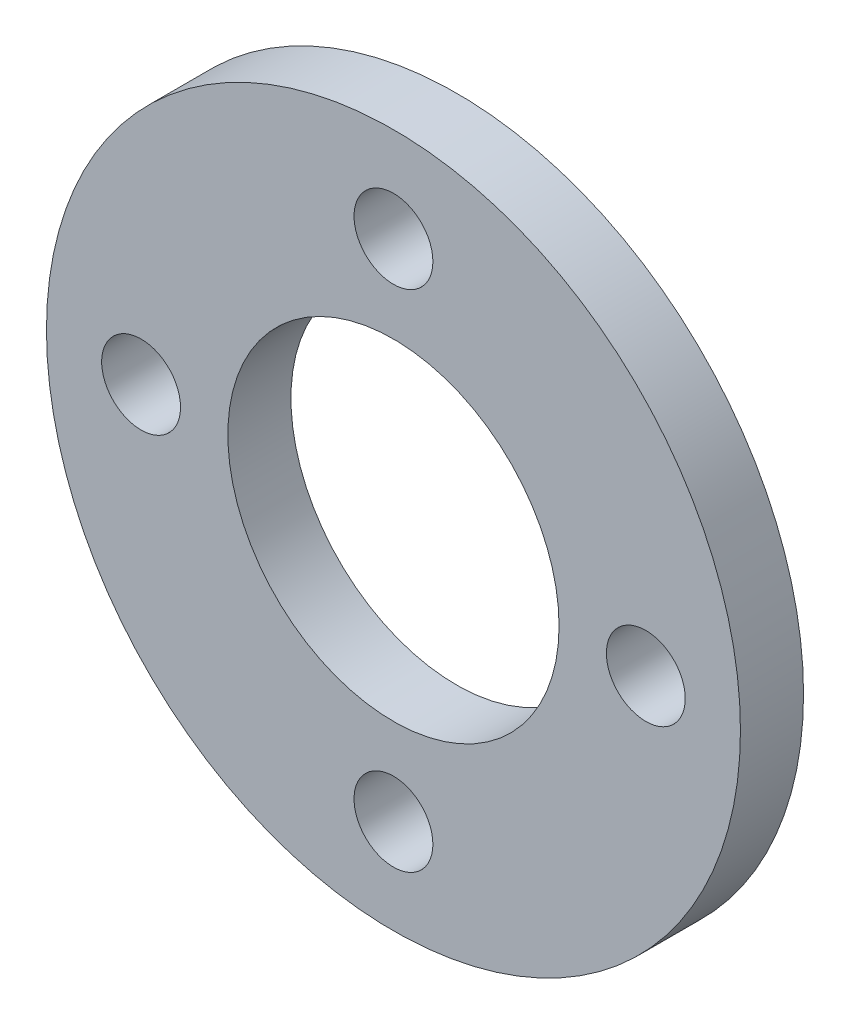
ISO-10303-21;
HEADER;
FILE_DESCRIPTION(('STEP AP214'),'2;1');
FILE_NAME('part.step','',(''),(''),'','','');
FILE_SCHEMA(('AUTOMOTIVE_DESIGN { 1 0 10303 214 1 1 1 1 }'));
ENDSEC;
DATA;
#1=APPLICATION_CONTEXT('core data for automotive mechanical design processes');
#2=APPLICATION_PROTOCOL_DEFINITION('international standard','automotive_design',2000,#1);
#3=PRODUCT_CONTEXT('',#1,'mechanical');
#4=PRODUCT('Part','Part','',(#3));
#5=PRODUCT_RELATED_PRODUCT_CATEGORY('part','',(#4));
#6=PRODUCT_DEFINITION_FORMATION('','',#4);
#7=PRODUCT_DEFINITION_CONTEXT('part definition',#1,'design');
#8=PRODUCT_DEFINITION('design','',#6,#7);
#9=PRODUCT_DEFINITION_SHAPE('','',#8);
#10=(LENGTH_UNIT() NAMED_UNIT(*) SI_UNIT(.MILLI.,.METRE.));
#11=(NAMED_UNIT(*) PLANE_ANGLE_UNIT() SI_UNIT($,.RADIAN.));
#12=(NAMED_UNIT(*) SI_UNIT($,.STERADIAN.) SOLID_ANGLE_UNIT());
#13=UNCERTAINTY_MEASURE_WITH_UNIT(LENGTH_MEASURE(1.E-05),#10,'distance_accuracy_value','');
#14=(GEOMETRIC_REPRESENTATION_CONTEXT(3) GLOBAL_UNCERTAINTY_ASSIGNED_CONTEXT((#13)) GLOBAL_UNIT_ASSIGNED_CONTEXT((#10,
#11,#12)) REPRESENTATION_CONTEXT('',''));
#15=CARTESIAN_POINT('',(0.,0.,0.));
#16=DIRECTION('',(0.,0.,1.));
#17=DIRECTION('',(1.,0.,0.));
#18=AXIS2_PLACEMENT_3D('',#15,#16,#17);
#19=CARTESIAN_POINT('',(0.,0.,2.));
#20=DIRECTION('',(0.,0.,1.));
#21=DIRECTION('',(1.,0.,0.));
#22=AXIS2_PLACEMENT_3D('',#19,#20,#21);
#23=PLANE('',#22);
#24=CARTESIAN_POINT('',(0.,-8.,2.));
#25=DIRECTION('',(0.,0.,1.));
#26=DIRECTION('',(1.,0.,0.));
#27=AXIS2_PLACEMENT_3D('',#24,#25,#26);
#28=CIRCLE('',#27,1.25);
#29=CARTESIAN_POINT('',(1.25,-8.,2.));
#30=VERTEX_POINT('',#29);
#31=EDGE_CURVE('E70',#30,#30,#28,.T.);
#32=ORIENTED_EDGE('',*,*,#31,.F.);
#33=EDGE_LOOP('',(#32));
#34=FACE_BOUND('',#33,.T.);
#35=CARTESIAN_POINT('',(0.,8.,2.));
#36=DIRECTION('',(0.,0.,1.));
#37=DIRECTION('',(1.,0.,0.));
#38=AXIS2_PLACEMENT_3D('',#35,#36,#37);
#39=CIRCLE('',#38,1.25);
#40=CARTESIAN_POINT('',(1.25,8.,2.));
#41=VERTEX_POINT('',#40);
#42=EDGE_CURVE('E58',#41,#41,#39,.T.);
#43=ORIENTED_EDGE('',*,*,#42,.F.);
#44=EDGE_LOOP('',(#43));
#45=FACE_BOUND('',#44,.T.);
#46=CARTESIAN_POINT('',(0.,0.,2.));
#47=DIRECTION('',(0.,0.,1.));
#48=DIRECTION('',(1.,0.,0.));
#49=AXIS2_PLACEMENT_3D('',#46,#47,#48);
#50=CIRCLE('',#49,11.);
#51=CARTESIAN_POINT('',(11.,0.,2.));
#52=VERTEX_POINT('',#51);
#53=EDGE_CURVE('E10',#52,#52,#50,.T.);
#54=ORIENTED_EDGE('',*,*,#53,.T.);
#55=EDGE_LOOP('',(#54));
#56=FACE_BOUND('',#55,.T.);
#57=CARTESIAN_POINT('',(0.,0.,2.));
#58=DIRECTION('',(0.,0.,1.));
#59=DIRECTION('',(1.,0.,0.));
#60=AXIS2_PLACEMENT_3D('',#57,#58,#59);
#61=CIRCLE('',#60,5.25);
#62=CARTESIAN_POINT('',(5.25,0.,2.));
#63=VERTEX_POINT('',#62);
#64=EDGE_CURVE('E53',#63,#63,#61,.T.);
#65=ORIENTED_EDGE('',*,*,#64,.F.);
#66=EDGE_LOOP('',(#65));
#67=FACE_BOUND('',#66,.T.);
#68=CARTESIAN_POINT('',(8.,0.,2.));
#69=DIRECTION('',(0.,0.,1.));
#70=DIRECTION('',(1.,0.,0.));
#71=AXIS2_PLACEMENT_3D('',#68,#69,#70);
#72=CIRCLE('',#71,1.25);
#73=CARTESIAN_POINT('',(9.25,0.,2.));
#74=VERTEX_POINT('',#73);
#75=EDGE_CURVE('E64',#74,#74,#72,.T.);
#76=ORIENTED_EDGE('',*,*,#75,.F.);
#77=EDGE_LOOP('',(#76));
#78=FACE_BOUND('',#77,.T.);
#79=CARTESIAN_POINT('',(-8.,0.,2.));
#80=DIRECTION('',(0.,0.,1.));
#81=DIRECTION('',(1.,0.,0.));
#82=AXIS2_PLACEMENT_3D('',#79,#80,#81);
#83=CIRCLE('',#82,1.25);
#84=CARTESIAN_POINT('',(-6.75,0.,2.));
#85=VERTEX_POINT('',#84);
#86=EDGE_CURVE('E76',#85,#85,#83,.T.);
#87=ORIENTED_EDGE('',*,*,#86,.F.);
#88=EDGE_LOOP('',(#87));
#89=FACE_BOUND('',#88,.T.);
#90=ADVANCED_FACE('F42',(#34,#45,#56,#67,#78,#89),#23,.T.);
#91=CARTESIAN_POINT('',(0.,0.,0.));
#92=DIRECTION('',(0.,0.,1.));
#93=DIRECTION('',(1.,0.,0.));
#94=AXIS2_PLACEMENT_3D('',#91,#92,#93);
#95=PLANE('',#94);
#96=CARTESIAN_POINT('',(0.,0.,0.));
#97=DIRECTION('',(0.,0.,1.));
#98=DIRECTION('',(1.,0.,0.));
#99=AXIS2_PLACEMENT_3D('',#96,#97,#98);
#100=CIRCLE('',#99,11.);
#101=CARTESIAN_POINT('',(11.,0.,0.));
#102=VERTEX_POINT('',#101);
#103=EDGE_CURVE('E46',#102,#102,#100,.T.);
#104=ORIENTED_EDGE('',*,*,#103,.F.);
#105=EDGE_LOOP('',(#104));
#106=FACE_BOUND('',#105,.T.);
#107=CARTESIAN_POINT('',(0.,0.,0.));
#108=DIRECTION('',(0.,0.,1.));
#109=DIRECTION('',(1.,0.,0.));
#110=AXIS2_PLACEMENT_3D('',#107,#108,#109);
#111=CIRCLE('',#110,5.25);
#112=CARTESIAN_POINT('',(5.25,0.,0.));
#113=VERTEX_POINT('',#112);
#114=EDGE_CURVE('E55',#113,#113,#111,.T.);
#115=ORIENTED_EDGE('',*,*,#114,.T.);
#116=EDGE_LOOP('',(#115));
#117=FACE_BOUND('',#116,.T.);
#118=CARTESIAN_POINT('',(0.,8.,0.));
#119=DIRECTION('',(0.,0.,1.));
#120=DIRECTION('',(1.,0.,0.));
#121=AXIS2_PLACEMENT_3D('',#118,#119,#120);
#122=CIRCLE('',#121,1.25);
#123=CARTESIAN_POINT('',(1.25,8.,0.));
#124=VERTEX_POINT('',#123);
#125=EDGE_CURVE('E61',#124,#124,#122,.T.);
#126=ORIENTED_EDGE('',*,*,#125,.T.);
#127=EDGE_LOOP('',(#126));
#128=FACE_BOUND('',#127,.T.);
#129=CARTESIAN_POINT('',(8.,0.,0.));
#130=DIRECTION('',(0.,0.,1.));
#131=DIRECTION('',(1.,0.,0.));
#132=AXIS2_PLACEMENT_3D('',#129,#130,#131);
#133=CIRCLE('',#132,1.25);
#134=CARTESIAN_POINT('',(9.25,0.,0.));
#135=VERTEX_POINT('',#134);
#136=EDGE_CURVE('E67',#135,#135,#133,.T.);
#137=ORIENTED_EDGE('',*,*,#136,.T.);
#138=EDGE_LOOP('',(#137));
#139=FACE_BOUND('',#138,.T.);
#140=CARTESIAN_POINT('',(0.,-8.,0.));
#141=DIRECTION('',(0.,0.,1.));
#142=DIRECTION('',(1.,0.,0.));
#143=AXIS2_PLACEMENT_3D('',#140,#141,#142);
#144=CIRCLE('',#143,1.25);
#145=CARTESIAN_POINT('',(1.25,-8.,0.));
#146=VERTEX_POINT('',#145);
#147=EDGE_CURVE('E73',#146,#146,#144,.T.);
#148=ORIENTED_EDGE('',*,*,#147,.T.);
#149=EDGE_LOOP('',(#148));
#150=FACE_BOUND('',#149,.T.);
#151=CARTESIAN_POINT('',(-8.,0.,0.));
#152=DIRECTION('',(0.,0.,1.));
#153=DIRECTION('',(1.,0.,0.));
#154=AXIS2_PLACEMENT_3D('',#151,#152,#153);
#155=CIRCLE('',#154,1.25);
#156=CARTESIAN_POINT('',(-6.75,0.,0.));
#157=VERTEX_POINT('',#156);
#158=EDGE_CURVE('E79',#157,#157,#155,.T.);
#159=ORIENTED_EDGE('',*,*,#158,.T.);
#160=EDGE_LOOP('',(#159));
#161=FACE_BOUND('',#160,.T.);
#162=ADVANCED_FACE('F89',(#106,#117,#128,#139,#150,#161),#95,.F.);
#163=CARTESIAN_POINT('',(0.,0.,2.));
#164=DIRECTION('',(0.,0.,-1.));
#165=DIRECTION('',(-1.,0.,0.));
#166=AXIS2_PLACEMENT_3D('',#163,#164,#165);
#167=CYLINDRICAL_SURFACE('',#166,11.);
#168=ORIENTED_EDGE('',*,*,#53,.F.);
#169=EDGE_LOOP('',(#168));
#170=FACE_BOUND('',#169,.T.);
#171=ORIENTED_EDGE('',*,*,#103,.T.);
#172=EDGE_LOOP('',(#171));
#173=FACE_BOUND('',#172,.T.);
#174=ADVANCED_FACE('F44',(#170,#173),#167,.T.);
#175=CARTESIAN_POINT('',(0.,0.,2.));
#176=DIRECTION('',(0.,0.,-1.));
#177=DIRECTION('',(-1.,0.,0.));
#178=AXIS2_PLACEMENT_3D('',#175,#176,#177);
#179=CYLINDRICAL_SURFACE('',#178,5.25);
#180=ORIENTED_EDGE('',*,*,#64,.T.);
#181=EDGE_LOOP('',(#180));
#182=FACE_BOUND('',#181,.T.);
#183=ORIENTED_EDGE('',*,*,#114,.F.);
#184=EDGE_LOOP('',(#183));
#185=FACE_BOUND('',#184,.T.);
#186=ADVANCED_FACE('F99',(#182,#185),#179,.F.);
#187=CARTESIAN_POINT('',(0.,8.,2.));
#188=DIRECTION('',(0.,0.,-1.));
#189=DIRECTION('',(-1.,0.,0.));
#190=AXIS2_PLACEMENT_3D('',#187,#188,#189);
#191=CYLINDRICAL_SURFACE('',#190,1.25);
#192=ORIENTED_EDGE('',*,*,#42,.T.);
#193=EDGE_LOOP('',(#192));
#194=FACE_BOUND('',#193,.T.);
#195=ORIENTED_EDGE('',*,*,#125,.F.);
#196=EDGE_LOOP('',(#195));
#197=FACE_BOUND('',#196,.T.);
#198=ADVANCED_FACE('F102',(#194,#197),#191,.F.);
#199=CARTESIAN_POINT('',(8.,0.,2.));
#200=DIRECTION('',(0.,0.,-1.));
#201=DIRECTION('',(-1.,0.,0.));
#202=AXIS2_PLACEMENT_3D('',#199,#200,#201);
#203=CYLINDRICAL_SURFACE('',#202,1.25);
#204=ORIENTED_EDGE('',*,*,#75,.T.);
#205=EDGE_LOOP('',(#204));
#206=FACE_BOUND('',#205,.T.);
#207=ORIENTED_EDGE('',*,*,#136,.F.);
#208=EDGE_LOOP('',(#207));
#209=FACE_BOUND('',#208,.T.);
#210=ADVANCED_FACE('F106',(#206,#209),#203,.F.);
#211=CARTESIAN_POINT('',(0.,-8.,2.));
#212=DIRECTION('',(0.,0.,-1.));
#213=DIRECTION('',(-1.,0.,0.));
#214=AXIS2_PLACEMENT_3D('',#211,#212,#213);
#215=CYLINDRICAL_SURFACE('',#214,1.25);
#216=ORIENTED_EDGE('',*,*,#31,.T.);
#217=EDGE_LOOP('',(#216));
#218=FACE_BOUND('',#217,.T.);
#219=ORIENTED_EDGE('',*,*,#147,.F.);
#220=EDGE_LOOP('',(#219));
#221=FACE_BOUND('',#220,.T.);
#222=ADVANCED_FACE('F110',(#218,#221),#215,.F.);
#223=CARTESIAN_POINT('',(-8.,0.,2.));
#224=DIRECTION('',(0.,0.,-1.));
#225=DIRECTION('',(-1.,0.,0.));
#226=AXIS2_PLACEMENT_3D('',#223,#224,#225);
#227=CYLINDRICAL_SURFACE('',#226,1.25);
#228=ORIENTED_EDGE('',*,*,#86,.T.);
#229=EDGE_LOOP('',(#228));
#230=FACE_BOUND('',#229,.T.);
#231=ORIENTED_EDGE('',*,*,#158,.F.);
#232=EDGE_LOOP('',(#231));
#233=FACE_BOUND('',#232,.T.);
#234=ADVANCED_FACE('F85',(#230,#233),#227,.F.);
#235=CLOSED_SHELL('',(#90,#162,#174,#186,#198,#210,#222,#234));
#236=MANIFOLD_SOLID_BREP('B2',#235);
#237=ADVANCED_BREP_SHAPE_REPRESENTATION('',(#18,#236),#14);
#238=SHAPE_DEFINITION_REPRESENTATION(#9,#237);
ENDSEC;
END-ISO-10303-21;
